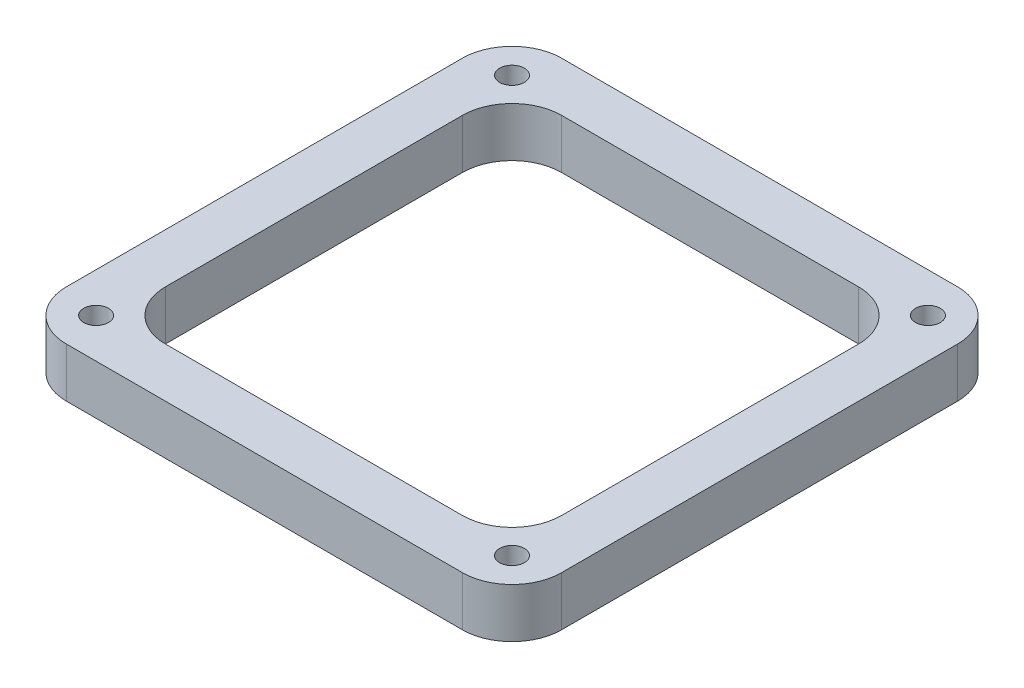
ISO-10303-21;
HEADER;
FILE_DESCRIPTION(('STEP AP214'),'2;1');
FILE_NAME('part.step','',(''),(''),'','','');
FILE_SCHEMA(('AUTOMOTIVE_DESIGN { 1 0 10303 214 1 1 1 1 }'));
ENDSEC;
DATA;
#1=APPLICATION_CONTEXT('core data for automotive mechanical design processes');
#2=APPLICATION_PROTOCOL_DEFINITION('international standard','automotive_design',2000,#1);
#3=PRODUCT_CONTEXT('',#1,'mechanical');
#4=PRODUCT('Part','Part','',(#3));
#5=PRODUCT_RELATED_PRODUCT_CATEGORY('part','',(#4));
#6=PRODUCT_DEFINITION_FORMATION('','',#4);
#7=PRODUCT_DEFINITION_CONTEXT('part definition',#1,'design');
#8=PRODUCT_DEFINITION('design','',#6,#7);
#9=PRODUCT_DEFINITION_SHAPE('','',#8);
#10=(LENGTH_UNIT() NAMED_UNIT(*) SI_UNIT(.MILLI.,.METRE.));
#11=(NAMED_UNIT(*) PLANE_ANGLE_UNIT() SI_UNIT($,.RADIAN.));
#12=(NAMED_UNIT(*) SI_UNIT($,.STERADIAN.) SOLID_ANGLE_UNIT());
#13=UNCERTAINTY_MEASURE_WITH_UNIT(LENGTH_MEASURE(1.E-05),#10,'distance_accuracy_value','');
#14=(GEOMETRIC_REPRESENTATION_CONTEXT(3) GLOBAL_UNCERTAINTY_ASSIGNED_CONTEXT((#13)) GLOBAL_UNIT_ASSIGNED_CONTEXT((#10,
#11,#12)) REPRESENTATION_CONTEXT('',''));
#15=CARTESIAN_POINT('',(0.,0.,0.));
#16=DIRECTION('',(0.,0.,1.));
#17=DIRECTION('',(1.,0.,0.));
#18=AXIS2_PLACEMENT_3D('',#15,#16,#17);
#19=CARTESIAN_POINT('',(-40.,10.,40.));
#20=DIRECTION('',(0.,-1.,0.));
#21=DIRECTION('',(0.,0.,-1.));
#22=AXIS2_PLACEMENT_3D('',#19,#20,#21);
#23=CYLINDRICAL_SURFACE('',#22,10.);
#24=CARTESIAN_POINT('',(-40.,0.,40.));
#25=DIRECTION('',(0.,1.,0.));
#26=DIRECTION('',(0.,0.,1.));
#27=AXIS2_PLACEMENT_3D('',#24,#25,#26);
#28=CIRCLE('',#27,10.);
#29=CARTESIAN_POINT('',(-50.,0.,39.9999999999999));
#30=VERTEX_POINT('',#29);
#31=CARTESIAN_POINT('',(-39.9999999999999,0.,50.));
#32=VERTEX_POINT('',#31);
#33=EDGE_CURVE('E205',#30,#32,#28,.T.);
#34=ORIENTED_EDGE('',*,*,#33,.T.);
#35=DIRECTION('',(0.,-1.,0.));
#36=VECTOR('',#35,1.);
#37=CARTESIAN_POINT('',(-39.9999999999999,10.,50.));
#38=LINE('',#37,#36);
#39=CARTESIAN_POINT('',(-39.9999999999999,10.,50.));
#40=VERTEX_POINT('',#39);
#41=EDGE_CURVE('E11',#40,#32,#38,.T.);
#42=ORIENTED_EDGE('',*,*,#41,.F.);
#43=CARTESIAN_POINT('',(-40.,10.,40.));
#44=DIRECTION('',(0.,1.,0.));
#45=DIRECTION('',(0.,0.,1.));
#46=AXIS2_PLACEMENT_3D('',#43,#44,#45);
#47=CIRCLE('',#46,10.);
#48=CARTESIAN_POINT('',(-50.,10.,39.9999999999999));
#49=VERTEX_POINT('',#48);
#50=EDGE_CURVE('E217',#49,#40,#47,.T.);
#51=ORIENTED_EDGE('',*,*,#50,.F.);
#52=DIRECTION('',(0.,-1.,0.));
#53=VECTOR('',#52,1.);
#54=CARTESIAN_POINT('',(-50.,10.,39.9999999999999));
#55=LINE('',#54,#53);
#56=EDGE_CURVE('E235',#49,#30,#55,.T.);
#57=ORIENTED_EDGE('',*,*,#56,.T.);
#58=EDGE_LOOP('',(#34,#42,#51,#57));
#59=FACE_BOUND('',#58,.T.);
#60=ADVANCED_FACE('F32',(#59),#23,.T.);
#61=CARTESIAN_POINT('',(-39.9999999999999,10.,50.));
#62=DIRECTION('',(0.,0.,-1.));
#63=DIRECTION('',(-1.,0.,0.));
#64=AXIS2_PLACEMENT_3D('',#61,#62,#63);
#65=PLANE('',#64);
#66=DIRECTION('',(1.,0.,0.));
#67=VECTOR('',#66,1.);
#68=CARTESIAN_POINT('',(-39.9999999999999,0.,50.));
#69=LINE('',#68,#67);
#70=CARTESIAN_POINT('',(39.9999999999999,0.,50.));
#71=VERTEX_POINT('',#70);
#72=EDGE_CURVE('E238',#32,#71,#69,.T.);
#73=ORIENTED_EDGE('',*,*,#72,.T.);
#74=DIRECTION('',(0.,-1.,0.));
#75=VECTOR('',#74,1.);
#76=CARTESIAN_POINT('',(39.9999999999999,10.,50.));
#77=LINE('',#76,#75);
#78=CARTESIAN_POINT('',(39.9999999999999,10.,50.));
#79=VERTEX_POINT('',#78);
#80=EDGE_CURVE('E39',#79,#71,#77,.T.);
#81=ORIENTED_EDGE('',*,*,#80,.F.);
#82=DIRECTION('',(1.,0.,0.));
#83=VECTOR('',#82,1.);
#84=CARTESIAN_POINT('',(-39.9999999999999,10.,50.));
#85=LINE('',#84,#83);
#86=EDGE_CURVE('E220',#40,#79,#85,.T.);
#87=ORIENTED_EDGE('',*,*,#86,.F.);
#88=ORIENTED_EDGE('',*,*,#41,.T.);
#89=EDGE_LOOP('',(#73,#81,#87,#88));
#90=FACE_BOUND('',#89,.T.);
#91=ADVANCED_FACE('F293',(#90),#65,.F.);
#92=CARTESIAN_POINT('',(40.,10.,40.));
#93=DIRECTION('',(0.,-1.,0.));
#94=DIRECTION('',(0.,0.,-1.));
#95=AXIS2_PLACEMENT_3D('',#92,#93,#94);
#96=CYLINDRICAL_SURFACE('',#95,10.);
#97=CARTESIAN_POINT('',(40.,0.,40.));
#98=DIRECTION('',(0.,1.,0.));
#99=DIRECTION('',(0.,0.,1.));
#100=AXIS2_PLACEMENT_3D('',#97,#98,#99);
#101=CIRCLE('',#100,10.);
#102=CARTESIAN_POINT('',(50.,0.,39.9999999999999));
#103=VERTEX_POINT('',#102);
#104=EDGE_CURVE('E240',#71,#103,#101,.T.);
#105=ORIENTED_EDGE('',*,*,#104,.T.);
#106=DIRECTION('',(0.,-1.,0.));
#107=VECTOR('',#106,1.);
#108=CARTESIAN_POINT('',(50.,10.,39.9999999999999));
#109=LINE('',#108,#107);
#110=CARTESIAN_POINT('',(50.,10.,39.9999999999999));
#111=VERTEX_POINT('',#110);
#112=EDGE_CURVE('E265',#111,#103,#109,.T.);
#113=ORIENTED_EDGE('',*,*,#112,.F.);
#114=CARTESIAN_POINT('',(40.,10.,40.));
#115=DIRECTION('',(0.,1.,0.));
#116=DIRECTION('',(0.,0.,1.));
#117=AXIS2_PLACEMENT_3D('',#114,#115,#116);
#118=CIRCLE('',#117,10.);
#119=EDGE_CURVE('E223',#79,#111,#118,.T.);
#120=ORIENTED_EDGE('',*,*,#119,.F.);
#121=ORIENTED_EDGE('',*,*,#80,.T.);
#122=EDGE_LOOP('',(#105,#113,#120,#121));
#123=FACE_BOUND('',#122,.T.);
#124=ADVANCED_FACE('F272',(#123),#96,.T.);
#125=CARTESIAN_POINT('',(50.,10.,-39.9999999999999));
#126=DIRECTION('',(-1.,0.,0.));
#127=DIRECTION('',(0.,0.,1.));
#128=AXIS2_PLACEMENT_3D('',#125,#126,#127);
#129=PLANE('',#128);
#130=DIRECTION('',(0.,0.,-1.));
#131=VECTOR('',#130,1.);
#132=CARTESIAN_POINT('',(50.,0.,-39.9999999999999));
#133=LINE('',#132,#131);
#134=CARTESIAN_POINT('',(50.,0.,-39.9999999999999));
#135=VERTEX_POINT('',#134);
#136=EDGE_CURVE('E242',#103,#135,#133,.T.);
#137=ORIENTED_EDGE('',*,*,#136,.T.);
#138=DIRECTION('',(0.,-1.,0.));
#139=VECTOR('',#138,1.);
#140=CARTESIAN_POINT('',(50.,10.,-39.9999999999999));
#141=LINE('',#140,#139);
#142=CARTESIAN_POINT('',(50.,10.,-39.9999999999999));
#143=VERTEX_POINT('',#142);
#144=EDGE_CURVE('E262',#143,#135,#141,.T.);
#145=ORIENTED_EDGE('',*,*,#144,.F.);
#146=DIRECTION('',(0.,0.,-1.));
#147=VECTOR('',#146,1.);
#148=CARTESIAN_POINT('',(50.,10.,-39.9999999999999));
#149=LINE('',#148,#147);
#150=EDGE_CURVE('E225',#111,#143,#149,.T.);
#151=ORIENTED_EDGE('',*,*,#150,.F.);
#152=ORIENTED_EDGE('',*,*,#112,.T.);
#153=EDGE_LOOP('',(#137,#145,#151,#152));
#154=FACE_BOUND('',#153,.T.);
#155=ADVANCED_FACE('F281',(#154),#129,.F.);
#156=CARTESIAN_POINT('',(40.,10.,-40.));
#157=DIRECTION('',(0.,-1.,0.));
#158=DIRECTION('',(0.,0.,-1.));
#159=AXIS2_PLACEMENT_3D('',#156,#157,#158);
#160=CYLINDRICAL_SURFACE('',#159,10.);
#161=CARTESIAN_POINT('',(40.,0.,-40.));
#162=DIRECTION('',(0.,1.,0.));
#163=DIRECTION('',(0.,0.,1.));
#164=AXIS2_PLACEMENT_3D('',#161,#162,#163);
#165=CIRCLE('',#164,10.);
#166=CARTESIAN_POINT('',(39.9999999999999,0.,-50.));
#167=VERTEX_POINT('',#166);
#168=EDGE_CURVE('E244',#135,#167,#165,.T.);
#169=ORIENTED_EDGE('',*,*,#168,.T.);
#170=DIRECTION('',(0.,-1.,0.));
#171=VECTOR('',#170,1.);
#172=CARTESIAN_POINT('',(39.9999999999999,10.,-50.));
#173=LINE('',#172,#171);
#174=CARTESIAN_POINT('',(39.9999999999999,10.,-50.));
#175=VERTEX_POINT('',#174);
#176=EDGE_CURVE('E259',#175,#167,#173,.T.);
#177=ORIENTED_EDGE('',*,*,#176,.F.);
#178=CARTESIAN_POINT('',(40.,10.,-40.));
#179=DIRECTION('',(0.,1.,0.));
#180=DIRECTION('',(0.,0.,1.));
#181=AXIS2_PLACEMENT_3D('',#178,#179,#180);
#182=CIRCLE('',#181,10.);
#183=EDGE_CURVE('E227',#143,#175,#182,.T.);
#184=ORIENTED_EDGE('',*,*,#183,.F.);
#185=ORIENTED_EDGE('',*,*,#144,.T.);
#186=EDGE_LOOP('',(#169,#177,#184,#185));
#187=FACE_BOUND('',#186,.T.);
#188=ADVANCED_FACE('F285',(#187),#160,.T.);
#189=CARTESIAN_POINT('',(-39.9999999999999,10.,-50.));
#190=DIRECTION('',(0.,0.,1.));
#191=DIRECTION('',(1.,0.,0.));
#192=AXIS2_PLACEMENT_3D('',#189,#190,#191);
#193=PLANE('',#192);
#194=DIRECTION('',(-1.,0.,0.));
#195=VECTOR('',#194,1.);
#196=CARTESIAN_POINT('',(-39.9999999999999,0.,-50.));
#197=LINE('',#196,#195);
#198=CARTESIAN_POINT('',(-39.9999999999999,0.,-50.));
#199=VERTEX_POINT('',#198);
#200=EDGE_CURVE('E246',#167,#199,#197,.T.);
#201=ORIENTED_EDGE('',*,*,#200,.T.);
#202=DIRECTION('',(0.,-1.,0.));
#203=VECTOR('',#202,1.);
#204=CARTESIAN_POINT('',(-39.9999999999999,10.,-50.));
#205=LINE('',#204,#203);
#206=CARTESIAN_POINT('',(-39.9999999999999,10.,-50.));
#207=VERTEX_POINT('',#206);
#208=EDGE_CURVE('E256',#207,#199,#205,.T.);
#209=ORIENTED_EDGE('',*,*,#208,.F.);
#210=DIRECTION('',(-1.,0.,0.));
#211=VECTOR('',#210,1.);
#212=CARTESIAN_POINT('',(-39.9999999999999,10.,-50.));
#213=LINE('',#212,#211);
#214=EDGE_CURVE('E229',#175,#207,#213,.T.);
#215=ORIENTED_EDGE('',*,*,#214,.F.);
#216=ORIENTED_EDGE('',*,*,#176,.T.);
#217=EDGE_LOOP('',(#201,#209,#215,#216));
#218=FACE_BOUND('',#217,.T.);
#219=ADVANCED_FACE('F306',(#218),#193,.F.);
#220=CARTESIAN_POINT('',(-40.,10.,-40.));
#221=DIRECTION('',(0.,-1.,0.));
#222=DIRECTION('',(0.,0.,-1.));
#223=AXIS2_PLACEMENT_3D('',#220,#221,#222);
#224=CYLINDRICAL_SURFACE('',#223,10.);
#225=CARTESIAN_POINT('',(-40.,0.,-40.));
#226=DIRECTION('',(0.,1.,0.));
#227=DIRECTION('',(0.,0.,1.));
#228=AXIS2_PLACEMENT_3D('',#225,#226,#227);
#229=CIRCLE('',#228,10.);
#230=CARTESIAN_POINT('',(-50.,0.,-39.9999999999999));
#231=VERTEX_POINT('',#230);
#232=EDGE_CURVE('E248',#199,#231,#229,.T.);
#233=ORIENTED_EDGE('',*,*,#232,.T.);
#234=DIRECTION('',(0.,-1.,0.));
#235=VECTOR('',#234,1.);
#236=CARTESIAN_POINT('',(-50.,10.,-39.9999999999999));
#237=LINE('',#236,#235);
#238=CARTESIAN_POINT('',(-50.,10.,-39.9999999999999));
#239=VERTEX_POINT('',#238);
#240=EDGE_CURVE('E253',#239,#231,#237,.T.);
#241=ORIENTED_EDGE('',*,*,#240,.F.);
#242=CARTESIAN_POINT('',(-40.,10.,-40.));
#243=DIRECTION('',(0.,1.,0.));
#244=DIRECTION('',(0.,0.,1.));
#245=AXIS2_PLACEMENT_3D('',#242,#243,#244);
#246=CIRCLE('',#245,10.);
#247=EDGE_CURVE('E231',#207,#239,#246,.T.);
#248=ORIENTED_EDGE('',*,*,#247,.F.);
#249=ORIENTED_EDGE('',*,*,#208,.T.);
#250=EDGE_LOOP('',(#233,#241,#248,#249));
#251=FACE_BOUND('',#250,.T.);
#252=ADVANCED_FACE('F304',(#251),#224,.T.);
#253=CARTESIAN_POINT('',(-50.,10.,-39.9999999999999));
#254=DIRECTION('',(1.,0.,0.));
#255=DIRECTION('',(0.,0.,-1.));
#256=AXIS2_PLACEMENT_3D('',#253,#254,#255);
#257=PLANE('',#256);
#258=DIRECTION('',(0.,0.,1.));
#259=VECTOR('',#258,1.);
#260=CARTESIAN_POINT('',(-50.,0.,-39.9999999999999));
#261=LINE('',#260,#259);
#262=EDGE_CURVE('E221',#231,#30,#261,.T.);
#263=ORIENTED_EDGE('',*,*,#262,.T.);
#264=ORIENTED_EDGE('',*,*,#56,.F.);
#265=DIRECTION('',(0.,0.,1.));
#266=VECTOR('',#265,1.);
#267=CARTESIAN_POINT('',(-50.,10.,-39.9999999999999));
#268=LINE('',#267,#266);
#269=EDGE_CURVE('E233',#239,#49,#268,.T.);
#270=ORIENTED_EDGE('',*,*,#269,.F.);
#271=ORIENTED_EDGE('',*,*,#240,.T.);
#272=EDGE_LOOP('',(#263,#264,#270,#271));
#273=FACE_BOUND('',#272,.T.);
#274=ADVANCED_FACE('F299',(#273),#257,.F.);
#275=CARTESIAN_POINT('',(-40.,10.,40.));
#276=DIRECTION('',(0.,1.,0.));
#277=DIRECTION('',(0.,0.,1.));
#278=AXIS2_PLACEMENT_3D('',#275,#276,#277);
#279=PLANE('',#278);
#280=CARTESIAN_POINT('',(-41.9999861844258,10.,41.9999999999994));
#281=DIRECTION('',(0.,1.,0.));
#282=DIRECTION('',(0.,0.,1.));
#283=AXIS2_PLACEMENT_3D('',#280,#281,#282);
#284=CIRCLE('',#283,2.5);
#285=CARTESIAN_POINT('',(-41.9999861844258,10.,44.4999999999994));
#286=VERTEX_POINT('',#285);
#287=EDGE_CURVE('E531',#286,#286,#284,.T.);
#288=ORIENTED_EDGE('',*,*,#287,.F.);
#289=EDGE_LOOP('',(#288));
#290=FACE_BOUND('',#289,.T.);
#291=CARTESIAN_POINT('',(42.0000138155742,10.,41.9999999999982));
#292=DIRECTION('',(0.,1.,0.));
#293=DIRECTION('',(0.,0.,1.));
#294=AXIS2_PLACEMENT_3D('',#291,#292,#293);
#295=CIRCLE('',#294,2.5);
#296=CARTESIAN_POINT('',(42.0000138155742,10.,44.4999999999982));
#297=VERTEX_POINT('',#296);
#298=EDGE_CURVE('E530',#297,#297,#295,.T.);
#299=ORIENTED_EDGE('',*,*,#298,.F.);
#300=EDGE_LOOP('',(#299));
#301=FACE_BOUND('',#300,.T.);
#302=CARTESIAN_POINT('',(42.,10.,-42.0000000000012));
#303=DIRECTION('',(0.,1.,0.));
#304=DIRECTION('',(0.,0.,1.));
#305=AXIS2_PLACEMENT_3D('',#302,#303,#304);
#306=CIRCLE('',#305,2.5);
#307=CARTESIAN_POINT('',(42.,10.,-39.5000000000012));
#308=VERTEX_POINT('',#307);
#309=EDGE_CURVE('E546',#308,#308,#306,.T.);
#310=ORIENTED_EDGE('',*,*,#309,.F.);
#311=EDGE_LOOP('',(#310));
#312=FACE_BOUND('',#311,.T.);
#313=CARTESIAN_POINT('',(-42.,10.,-41.9999999999994));
#314=DIRECTION('',(0.,1.,0.));
#315=DIRECTION('',(0.,0.,1.));
#316=AXIS2_PLACEMENT_3D('',#313,#314,#315);
#317=CIRCLE('',#316,2.50000000000017);
#318=CARTESIAN_POINT('',(-42.,10.,-39.4999999999992));
#319=VERTEX_POINT('',#318);
#320=EDGE_CURVE('E169',#319,#319,#317,.T.);
#321=ORIENTED_EDGE('',*,*,#320,.F.);
#322=EDGE_LOOP('',(#321));
#323=FACE_BOUND('',#322,.T.);
#324=CARTESIAN_POINT('',(-30.,10.,30.));
#325=DIRECTION('',(0.,1.,0.));
#326=DIRECTION('',(0.,0.,1.));
#327=AXIS2_PLACEMENT_3D('',#324,#325,#326);
#328=CIRCLE('',#327,10.);
#329=CARTESIAN_POINT('',(-40.,10.,29.9999999999999));
#330=VERTEX_POINT('',#329);
#331=CARTESIAN_POINT('',(-29.9999999999999,10.,40.));
#332=VERTEX_POINT('',#331);
#333=EDGE_CURVE('E46',#330,#332,#328,.T.);
#334=ORIENTED_EDGE('',*,*,#333,.F.);
#335=DIRECTION('',(0.,0.,1.));
#336=VECTOR('',#335,1.);
#337=CARTESIAN_POINT('',(-40.,10.,29.9999999999999));
#338=LINE('',#337,#336);
#339=CARTESIAN_POINT('',(-40.,10.,-29.9999999999999));
#340=VERTEX_POINT('',#339);
#341=EDGE_CURVE('E163',#340,#330,#338,.T.);
#342=ORIENTED_EDGE('',*,*,#341,.F.);
#343=CARTESIAN_POINT('',(-30.,10.,-30.));
#344=DIRECTION('',(0.,1.,0.));
#345=DIRECTION('',(0.,0.,1.));
#346=AXIS2_PLACEMENT_3D('',#343,#344,#345);
#347=CIRCLE('',#346,10.);
#348=CARTESIAN_POINT('',(-29.9999999999999,10.,-40.));
#349=VERTEX_POINT('',#348);
#350=EDGE_CURVE('E166',#349,#340,#347,.T.);
#351=ORIENTED_EDGE('',*,*,#350,.F.);
#352=DIRECTION('',(-1.,0.,0.));
#353=VECTOR('',#352,1.);
#354=CARTESIAN_POINT('',(-29.9999999999999,10.,-40.));
#355=LINE('',#354,#353);
#356=CARTESIAN_POINT('',(29.9999999999999,10.,-40.));
#357=VERTEX_POINT('',#356);
#358=EDGE_CURVE('E198',#357,#349,#355,.T.);
#359=ORIENTED_EDGE('',*,*,#358,.F.);
#360=CARTESIAN_POINT('',(30.,10.,-30.));
#361=DIRECTION('',(0.,1.,0.));
#362=DIRECTION('',(0.,0.,1.));
#363=AXIS2_PLACEMENT_3D('',#360,#361,#362);
#364=CIRCLE('',#363,10.);
#365=CARTESIAN_POINT('',(40.,10.,-29.9999999999999));
#366=VERTEX_POINT('',#365);
#367=EDGE_CURVE('E195',#366,#357,#364,.T.);
#368=ORIENTED_EDGE('',*,*,#367,.F.);
#369=DIRECTION('',(0.,0.,-1.));
#370=VECTOR('',#369,1.);
#371=CARTESIAN_POINT('',(40.,10.,29.9999999999999));
#372=LINE('',#371,#370);
#373=CARTESIAN_POINT('',(40.,10.,29.9999999999999));
#374=VERTEX_POINT('',#373);
#375=EDGE_CURVE('E192',#374,#366,#372,.T.);
#376=ORIENTED_EDGE('',*,*,#375,.F.);
#377=CARTESIAN_POINT('',(30.,10.,30.));
#378=DIRECTION('',(0.,1.,0.));
#379=DIRECTION('',(0.,0.,1.));
#380=AXIS2_PLACEMENT_3D('',#377,#378,#379);
#381=CIRCLE('',#380,10.);
#382=CARTESIAN_POINT('',(29.9999999999999,10.,40.));
#383=VERTEX_POINT('',#382);
#384=EDGE_CURVE('E189',#383,#374,#381,.T.);
#385=ORIENTED_EDGE('',*,*,#384,.F.);
#386=DIRECTION('',(1.,0.,0.));
#387=VECTOR('',#386,1.);
#388=CARTESIAN_POINT('',(-29.9999999999999,10.,40.));
#389=LINE('',#388,#387);
#390=EDGE_CURVE('E186',#332,#383,#389,.T.);
#391=ORIENTED_EDGE('',*,*,#390,.F.);
#392=EDGE_LOOP('',(#334,#342,#351,#359,#368,#376,#385,#391));
#393=FACE_BOUND('',#392,.T.);
#394=ORIENTED_EDGE('',*,*,#50,.T.);
#395=ORIENTED_EDGE('',*,*,#86,.T.);
#396=ORIENTED_EDGE('',*,*,#119,.T.);
#397=ORIENTED_EDGE('',*,*,#150,.T.);
#398=ORIENTED_EDGE('',*,*,#183,.T.);
#399=ORIENTED_EDGE('',*,*,#214,.T.);
#400=ORIENTED_EDGE('',*,*,#247,.T.);
#401=ORIENTED_EDGE('',*,*,#269,.T.);
#402=EDGE_LOOP('',(#394,#395,#396,#397,#398,#399,#400,#401));
#403=FACE_BOUND('',#402,.T.);
#404=ADVANCED_FACE('F289',(#290,#301,#312,#323,#393,#403),#279,.T.);
#405=CARTESIAN_POINT('',(-40.,0.,40.));
#406=DIRECTION('',(0.,1.,0.));
#407=DIRECTION('',(0.,0.,1.));
#408=AXIS2_PLACEMENT_3D('',#405,#406,#407);
#409=PLANE('',#408);
#410=DIRECTION('',(0.,0.,1.));
#411=VECTOR('',#410,1.);
#412=CARTESIAN_POINT('',(-40.,0.,29.9999999999999));
#413=LINE('',#412,#411);
#414=CARTESIAN_POINT('',(-40.,0.,-29.9999999999999));
#415=VERTEX_POINT('',#414);
#416=CARTESIAN_POINT('',(-40.,0.,29.9999999999999));
#417=VERTEX_POINT('',#416);
#418=EDGE_CURVE('E152',#415,#417,#413,.T.);
#419=ORIENTED_EDGE('',*,*,#418,.T.);
#420=CARTESIAN_POINT('',(-30.,0.,30.));
#421=DIRECTION('',(0.,1.,0.));
#422=DIRECTION('',(0.,0.,1.));
#423=AXIS2_PLACEMENT_3D('',#420,#421,#422);
#424=CIRCLE('',#423,10.);
#425=CARTESIAN_POINT('',(-29.9999999999999,0.,40.));
#426=VERTEX_POINT('',#425);
#427=EDGE_CURVE('E146',#417,#426,#424,.T.);
#428=ORIENTED_EDGE('',*,*,#427,.T.);
#429=DIRECTION('',(1.,0.,0.));
#430=VECTOR('',#429,1.);
#431=CARTESIAN_POINT('',(-29.9999999999999,0.,40.));
#432=LINE('',#431,#430);
#433=CARTESIAN_POINT('',(29.9999999999999,0.,40.));
#434=VERTEX_POINT('',#433);
#435=EDGE_CURVE('E155',#426,#434,#432,.T.);
#436=ORIENTED_EDGE('',*,*,#435,.T.);
#437=CARTESIAN_POINT('',(30.,0.,30.));
#438=DIRECTION('',(0.,1.,0.));
#439=DIRECTION('',(0.,0.,1.));
#440=AXIS2_PLACEMENT_3D('',#437,#438,#439);
#441=CIRCLE('',#440,10.);
#442=CARTESIAN_POINT('',(40.,0.,29.9999999999999));
#443=VERTEX_POINT('',#442);
#444=EDGE_CURVE('E54',#434,#443,#441,.T.);
#445=ORIENTED_EDGE('',*,*,#444,.T.);
#446=DIRECTION('',(0.,0.,-1.));
#447=VECTOR('',#446,1.);
#448=CARTESIAN_POINT('',(40.,0.,29.9999999999999));
#449=LINE('',#448,#447);
#450=CARTESIAN_POINT('',(40.,0.,-29.9999999999999));
#451=VERTEX_POINT('',#450);
#452=EDGE_CURVE('E173',#443,#451,#449,.T.);
#453=ORIENTED_EDGE('',*,*,#452,.T.);
#454=CARTESIAN_POINT('',(30.,0.,-30.));
#455=DIRECTION('',(0.,1.,0.));
#456=DIRECTION('',(0.,0.,1.));
#457=AXIS2_PLACEMENT_3D('',#454,#455,#456);
#458=CIRCLE('',#457,10.);
#459=CARTESIAN_POINT('',(29.9999999999999,0.,-40.));
#460=VERTEX_POINT('',#459);
#461=EDGE_CURVE('E176',#451,#460,#458,.T.);
#462=ORIENTED_EDGE('',*,*,#461,.T.);
#463=DIRECTION('',(-1.,0.,0.));
#464=VECTOR('',#463,1.);
#465=CARTESIAN_POINT('',(-29.9999999999999,0.,-40.));
#466=LINE('',#465,#464);
#467=CARTESIAN_POINT('',(-29.9999999999999,0.,-40.));
#468=VERTEX_POINT('',#467);
#469=EDGE_CURVE('E179',#460,#468,#466,.T.);
#470=ORIENTED_EDGE('',*,*,#469,.T.);
#471=CARTESIAN_POINT('',(-30.,0.,-30.));
#472=DIRECTION('',(0.,1.,0.));
#473=DIRECTION('',(0.,0.,1.));
#474=AXIS2_PLACEMENT_3D('',#471,#472,#473);
#475=CIRCLE('',#474,10.);
#476=EDGE_CURVE('E182',#468,#415,#475,.T.);
#477=ORIENTED_EDGE('',*,*,#476,.T.);
#478=EDGE_LOOP('',(#419,#428,#436,#445,#453,#462,#470,#477));
#479=FACE_BOUND('',#478,.T.);
#480=ORIENTED_EDGE('',*,*,#33,.F.);
#481=ORIENTED_EDGE('',*,*,#262,.F.);
#482=ORIENTED_EDGE('',*,*,#232,.F.);
#483=ORIENTED_EDGE('',*,*,#200,.F.);
#484=ORIENTED_EDGE('',*,*,#168,.F.);
#485=ORIENTED_EDGE('',*,*,#136,.F.);
#486=ORIENTED_EDGE('',*,*,#104,.F.);
#487=ORIENTED_EDGE('',*,*,#72,.F.);
#488=EDGE_LOOP('',(#480,#481,#482,#483,#484,#485,#486,#487));
#489=FACE_BOUND('',#488,.T.);
#490=ADVANCED_FACE('F159',(#479,#489),#409,.F.);
#491=CARTESIAN_POINT('',(-30.,0.,30.));
#492=DIRECTION('',(0.,1.,0.));
#493=DIRECTION('',(0.,0.,1.));
#494=AXIS2_PLACEMENT_3D('',#491,#492,#493);
#495=CYLINDRICAL_SURFACE('',#494,10.);
#496=ORIENTED_EDGE('',*,*,#333,.T.);
#497=DIRECTION('',(0.,1.,0.));
#498=VECTOR('',#497,1.);
#499=CARTESIAN_POINT('',(-29.9999999999999,0.,40.));
#500=LINE('',#499,#498);
#501=EDGE_CURVE('E142',#426,#332,#500,.T.);
#502=ORIENTED_EDGE('',*,*,#501,.F.);
#503=ORIENTED_EDGE('',*,*,#427,.F.);
#504=DIRECTION('',(0.,1.,0.));
#505=VECTOR('',#504,1.);
#506=CARTESIAN_POINT('',(-40.,0.,29.9999999999999));
#507=LINE('',#506,#505);
#508=EDGE_CURVE('E203',#417,#330,#507,.T.);
#509=ORIENTED_EDGE('',*,*,#508,.T.);
#510=EDGE_LOOP('',(#496,#502,#503,#509));
#511=FACE_BOUND('',#510,.T.);
#512=ADVANCED_FACE('F144',(#511),#495,.F.);
#513=CARTESIAN_POINT('',(-40.,0.,29.9999999999999));
#514=DIRECTION('',(-1.,0.,0.));
#515=DIRECTION('',(0.,0.,1.));
#516=AXIS2_PLACEMENT_3D('',#513,#514,#515);
#517=PLANE('',#516);
#518=ORIENTED_EDGE('',*,*,#341,.T.);
#519=ORIENTED_EDGE('',*,*,#508,.F.);
#520=ORIENTED_EDGE('',*,*,#418,.F.);
#521=DIRECTION('',(0.,1.,0.));
#522=VECTOR('',#521,1.);
#523=CARTESIAN_POINT('',(-40.,0.,-29.9999999999999));
#524=LINE('',#523,#522);
#525=EDGE_CURVE('E206',#415,#340,#524,.T.);
#526=ORIENTED_EDGE('',*,*,#525,.T.);
#527=EDGE_LOOP('',(#518,#519,#520,#526));
#528=FACE_BOUND('',#527,.T.);
#529=ADVANCED_FACE('F370',(#528),#517,.F.);
#530=CARTESIAN_POINT('',(-30.,0.,-30.));
#531=DIRECTION('',(0.,1.,0.));
#532=DIRECTION('',(0.,0.,1.));
#533=AXIS2_PLACEMENT_3D('',#530,#531,#532);
#534=CYLINDRICAL_SURFACE('',#533,10.);
#535=ORIENTED_EDGE('',*,*,#350,.T.);
#536=ORIENTED_EDGE('',*,*,#525,.F.);
#537=ORIENTED_EDGE('',*,*,#476,.F.);
#538=DIRECTION('',(0.,1.,0.));
#539=VECTOR('',#538,1.);
#540=CARTESIAN_POINT('',(-29.9999999999999,0.,-40.));
#541=LINE('',#540,#539);
#542=EDGE_CURVE('E208',#468,#349,#541,.T.);
#543=ORIENTED_EDGE('',*,*,#542,.T.);
#544=EDGE_LOOP('',(#535,#536,#537,#543));
#545=FACE_BOUND('',#544,.T.);
#546=ADVANCED_FACE('F379',(#545),#534,.F.);
#547=CARTESIAN_POINT('',(-29.9999999999999,0.,-40.));
#548=DIRECTION('',(0.,0.,-1.));
#549=DIRECTION('',(-1.,0.,0.));
#550=AXIS2_PLACEMENT_3D('',#547,#548,#549);
#551=PLANE('',#550);
#552=ORIENTED_EDGE('',*,*,#358,.T.);
#553=ORIENTED_EDGE('',*,*,#542,.F.);
#554=ORIENTED_EDGE('',*,*,#469,.F.);
#555=DIRECTION('',(0.,1.,0.));
#556=VECTOR('',#555,1.);
#557=CARTESIAN_POINT('',(29.9999999999999,0.,-40.));
#558=LINE('',#557,#556);
#559=EDGE_CURVE('E210',#460,#357,#558,.T.);
#560=ORIENTED_EDGE('',*,*,#559,.T.);
#561=EDGE_LOOP('',(#552,#553,#554,#560));
#562=FACE_BOUND('',#561,.T.);
#563=ADVANCED_FACE('F389',(#562),#551,.F.);
#564=CARTESIAN_POINT('',(30.,0.,-30.));
#565=DIRECTION('',(0.,1.,0.));
#566=DIRECTION('',(0.,0.,1.));
#567=AXIS2_PLACEMENT_3D('',#564,#565,#566);
#568=CYLINDRICAL_SURFACE('',#567,10.);
#569=ORIENTED_EDGE('',*,*,#367,.T.);
#570=ORIENTED_EDGE('',*,*,#559,.F.);
#571=ORIENTED_EDGE('',*,*,#461,.F.);
#572=DIRECTION('',(0.,1.,0.));
#573=VECTOR('',#572,1.);
#574=CARTESIAN_POINT('',(40.,0.,-29.9999999999999));
#575=LINE('',#574,#573);
#576=EDGE_CURVE('E212',#451,#366,#575,.T.);
#577=ORIENTED_EDGE('',*,*,#576,.T.);
#578=EDGE_LOOP('',(#569,#570,#571,#577));
#579=FACE_BOUND('',#578,.T.);
#580=ADVANCED_FACE('F399',(#579),#568,.F.);
#581=CARTESIAN_POINT('',(40.,0.,29.9999999999999));
#582=DIRECTION('',(1.,0.,0.));
#583=DIRECTION('',(0.,0.,-1.));
#584=AXIS2_PLACEMENT_3D('',#581,#582,#583);
#585=PLANE('',#584);
#586=ORIENTED_EDGE('',*,*,#375,.T.);
#587=ORIENTED_EDGE('',*,*,#576,.F.);
#588=ORIENTED_EDGE('',*,*,#452,.F.);
#589=DIRECTION('',(0.,1.,0.));
#590=VECTOR('',#589,1.);
#591=CARTESIAN_POINT('',(40.,0.,29.9999999999999));
#592=LINE('',#591,#590);
#593=EDGE_CURVE('E214',#443,#374,#592,.T.);
#594=ORIENTED_EDGE('',*,*,#593,.T.);
#595=EDGE_LOOP('',(#586,#587,#588,#594));
#596=FACE_BOUND('',#595,.T.);
#597=ADVANCED_FACE('F409',(#596),#585,.F.);
#598=CARTESIAN_POINT('',(30.,0.,30.));
#599=DIRECTION('',(0.,1.,0.));
#600=DIRECTION('',(0.,0.,1.));
#601=AXIS2_PLACEMENT_3D('',#598,#599,#600);
#602=CYLINDRICAL_SURFACE('',#601,10.);
#603=ORIENTED_EDGE('',*,*,#384,.T.);
#604=ORIENTED_EDGE('',*,*,#593,.F.);
#605=ORIENTED_EDGE('',*,*,#444,.F.);
#606=DIRECTION('',(0.,1.,0.));
#607=VECTOR('',#606,1.);
#608=CARTESIAN_POINT('',(29.9999999999999,0.,40.));
#609=LINE('',#608,#607);
#610=EDGE_CURVE('E151',#434,#383,#609,.T.);
#611=ORIENTED_EDGE('',*,*,#610,.T.);
#612=EDGE_LOOP('',(#603,#604,#605,#611));
#613=FACE_BOUND('',#612,.T.);
#614=ADVANCED_FACE('F419',(#613),#602,.F.);
#615=CARTESIAN_POINT('',(-29.9999999999999,0.,40.));
#616=DIRECTION('',(0.,0.,1.));
#617=DIRECTION('',(1.,0.,0.));
#618=AXIS2_PLACEMENT_3D('',#615,#616,#617);
#619=PLANE('',#618);
#620=ORIENTED_EDGE('',*,*,#390,.T.);
#621=ORIENTED_EDGE('',*,*,#610,.F.);
#622=ORIENTED_EDGE('',*,*,#435,.F.);
#623=ORIENTED_EDGE('',*,*,#501,.T.);
#624=EDGE_LOOP('',(#620,#621,#622,#623));
#625=FACE_BOUND('',#624,.T.);
#626=ADVANCED_FACE('F156',(#625),#619,.F.);
#627=CARTESIAN_POINT('',(-42.,3.,-41.9999999999994));
#628=DIRECTION('',(0.,1.,0.));
#629=DIRECTION('',(0.,0.,1.));
#630=AXIS2_PLACEMENT_3D('',#627,#628,#629);
#631=CYLINDRICAL_SURFACE('',#630,2.50000000000017);
#632=CARTESIAN_POINT('',(-42.,3.,-41.9999999999994));
#633=DIRECTION('',(0.,1.,0.));
#634=DIRECTION('',(0.,0.,1.));
#635=AXIS2_PLACEMENT_3D('',#632,#633,#634);
#636=CIRCLE('',#635,2.50000000000017);
#637=CARTESIAN_POINT('',(-42.,3.,-39.4999999999992));
#638=VERTEX_POINT('',#637);
#639=EDGE_CURVE('E187',#638,#638,#636,.T.);
#640=ORIENTED_EDGE('',*,*,#639,.F.);
#641=EDGE_LOOP('',(#640));
#642=FACE_BOUND('',#641,.T.);
#643=ORIENTED_EDGE('',*,*,#320,.T.);
#644=EDGE_LOOP('',(#643));
#645=FACE_BOUND('',#644,.T.);
#646=ADVANCED_FACE('F437',(#642,#645),#631,.F.);
#647=CARTESIAN_POINT('',(-42.,3.,-41.9999999999994));
#648=DIRECTION('',(0.,1.,0.));
#649=DIRECTION('',(0.,0.,1.));
#650=AXIS2_PLACEMENT_3D('',#647,#648,#649);
#651=PLANE('',#650);
#652=ORIENTED_EDGE('',*,*,#639,.T.);
#653=EDGE_LOOP('',(#652));
#654=FACE_BOUND('',#653,.T.);
#655=ADVANCED_FACE('F453',(#654),#651,.T.);
#656=CARTESIAN_POINT('',(42.,3.,-42.0000000000012));
#657=DIRECTION('',(0.,1.,0.));
#658=DIRECTION('',(0.,0.,1.));
#659=AXIS2_PLACEMENT_3D('',#656,#657,#658);
#660=CYLINDRICAL_SURFACE('',#659,2.5);
#661=CARTESIAN_POINT('',(42.,3.,-42.0000000000012));
#662=DIRECTION('',(0.,1.,0.));
#663=DIRECTION('',(0.,0.,1.));
#664=AXIS2_PLACEMENT_3D('',#661,#662,#663);
#665=CIRCLE('',#664,2.5);
#666=CARTESIAN_POINT('',(42.,3.,-39.5000000000012));
#667=VERTEX_POINT('',#666);
#668=EDGE_CURVE('E542',#667,#667,#665,.T.);
#669=ORIENTED_EDGE('',*,*,#668,.F.);
#670=EDGE_LOOP('',(#669));
#671=FACE_BOUND('',#670,.T.);
#672=ORIENTED_EDGE('',*,*,#309,.T.);
#673=EDGE_LOOP('',(#672));
#674=FACE_BOUND('',#673,.T.);
#675=ADVANCED_FACE('F463',(#671,#674),#660,.F.);
#676=CARTESIAN_POINT('',(42.,3.,-42.0000000000012));
#677=DIRECTION('',(0.,1.,0.));
#678=DIRECTION('',(0.,0.,1.));
#679=AXIS2_PLACEMENT_3D('',#676,#677,#678);
#680=PLANE('',#679);
#681=ORIENTED_EDGE('',*,*,#668,.T.);
#682=EDGE_LOOP('',(#681));
#683=FACE_BOUND('',#682,.T.);
#684=ADVANCED_FACE('F473',(#683),#680,.T.);
#685=CARTESIAN_POINT('',(42.0000138155742,3.,41.9999999999982));
#686=DIRECTION('',(0.,1.,0.));
#687=DIRECTION('',(0.,0.,1.));
#688=AXIS2_PLACEMENT_3D('',#685,#686,#687);
#689=CYLINDRICAL_SURFACE('',#688,2.5);
#690=CARTESIAN_POINT('',(42.0000138155742,3.,41.9999999999982));
#691=DIRECTION('',(0.,1.,0.));
#692=DIRECTION('',(0.,0.,1.));
#693=AXIS2_PLACEMENT_3D('',#690,#691,#692);
#694=CIRCLE('',#693,2.5);
#695=CARTESIAN_POINT('',(42.0000138155742,3.,44.4999999999982));
#696=VERTEX_POINT('',#695);
#697=EDGE_CURVE('E534',#696,#696,#694,.T.);
#698=ORIENTED_EDGE('',*,*,#697,.F.);
#699=EDGE_LOOP('',(#698));
#700=FACE_BOUND('',#699,.T.);
#701=ORIENTED_EDGE('',*,*,#298,.T.);
#702=EDGE_LOOP('',(#701));
#703=FACE_BOUND('',#702,.T.);
#704=ADVANCED_FACE('F483',(#700,#703),#689,.F.);
#705=CARTESIAN_POINT('',(42.0000138155742,3.,41.9999999999982));
#706=DIRECTION('',(0.,1.,0.));
#707=DIRECTION('',(0.,0.,1.));
#708=AXIS2_PLACEMENT_3D('',#705,#706,#707);
#709=PLANE('',#708);
#710=ORIENTED_EDGE('',*,*,#697,.T.);
#711=EDGE_LOOP('',(#710));
#712=FACE_BOUND('',#711,.T.);
#713=ADVANCED_FACE('F493',(#712),#709,.T.);
#714=CARTESIAN_POINT('',(-41.9999861844258,3.,41.9999999999994));
#715=DIRECTION('',(0.,1.,0.));
#716=DIRECTION('',(0.,0.,1.));
#717=AXIS2_PLACEMENT_3D('',#714,#715,#716);
#718=CYLINDRICAL_SURFACE('',#717,2.5);
#719=CARTESIAN_POINT('',(-41.9999861844258,3.,41.9999999999994));
#720=DIRECTION('',(0.,1.,0.));
#721=DIRECTION('',(0.,0.,1.));
#722=AXIS2_PLACEMENT_3D('',#719,#720,#721);
#723=CIRCLE('',#722,2.5);
#724=CARTESIAN_POINT('',(-41.9999861844258,3.,44.4999999999994));
#725=VERTEX_POINT('',#724);
#726=EDGE_CURVE('E529',#725,#725,#723,.T.);
#727=ORIENTED_EDGE('',*,*,#726,.F.);
#728=EDGE_LOOP('',(#727));
#729=FACE_BOUND('',#728,.T.);
#730=ORIENTED_EDGE('',*,*,#287,.T.);
#731=EDGE_LOOP('',(#730));
#732=FACE_BOUND('',#731,.T.);
#733=ADVANCED_FACE('F503',(#729,#732),#718,.F.);
#734=CARTESIAN_POINT('',(-41.9999861844258,3.,41.9999999999994));
#735=DIRECTION('',(0.,1.,0.));
#736=DIRECTION('',(0.,0.,1.));
#737=AXIS2_PLACEMENT_3D('',#734,#735,#736);
#738=PLANE('',#737);
#739=ORIENTED_EDGE('',*,*,#726,.T.);
#740=EDGE_LOOP('',(#739));
#741=FACE_BOUND('',#740,.T.);
#742=ADVANCED_FACE('F513',(#741),#738,.T.);
#743=CLOSED_SHELL('',(#60,#91,#124,#155,#188,#219,#252,#274,#404,#490,#512,#529,#546,#563,#580,
#597,#614,#626,#646,#655,#675,#684,#704,#713,#733,#742));
#744=MANIFOLD_SOLID_BREP('B2',#743);
#745=ADVANCED_BREP_SHAPE_REPRESENTATION('',(#18,#744),#14);
#746=SHAPE_DEFINITION_REPRESENTATION(#9,#745);
ENDSEC;
END-ISO-10303-21;
